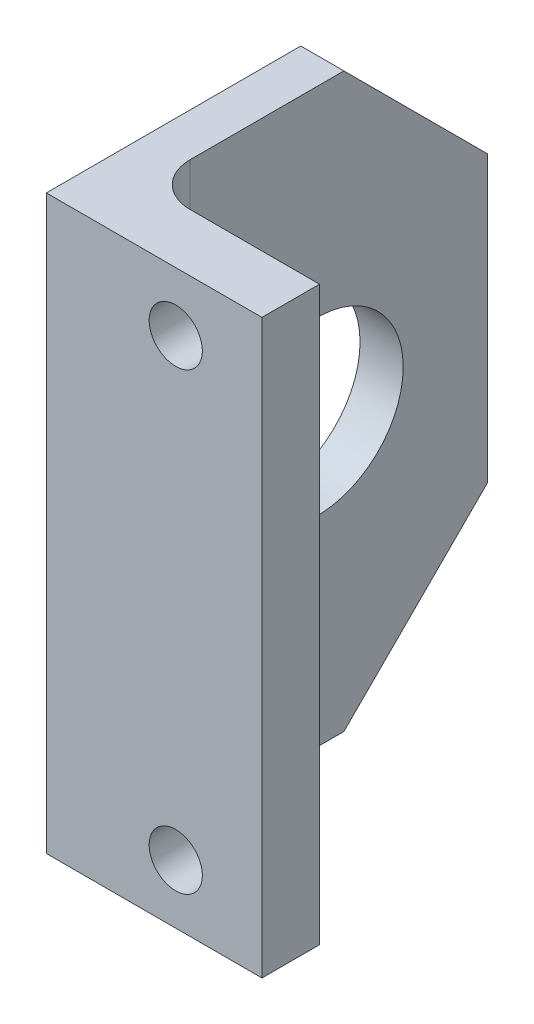
ISO-10303-21;
HEADER;
FILE_DESCRIPTION(('STEP AP214'),'2;1');
FILE_NAME('part.step','',(''),(''),'','','');
FILE_SCHEMA(('AUTOMOTIVE_DESIGN { 1 0 10303 214 1 1 1 1 }'));
ENDSEC;
DATA;
#1=APPLICATION_CONTEXT('core data for automotive mechanical design processes');
#2=APPLICATION_PROTOCOL_DEFINITION('international standard','automotive_design',2000,#1);
#3=PRODUCT_CONTEXT('',#1,'mechanical');
#4=PRODUCT('Part','Part','',(#3));
#5=PRODUCT_RELATED_PRODUCT_CATEGORY('part','',(#4));
#6=PRODUCT_DEFINITION_FORMATION('','',#4);
#7=PRODUCT_DEFINITION_CONTEXT('part definition',#1,'design');
#8=PRODUCT_DEFINITION('design','',#6,#7);
#9=PRODUCT_DEFINITION_SHAPE('','',#8);
#10=(LENGTH_UNIT() NAMED_UNIT(*) SI_UNIT(.MILLI.,.METRE.));
#11=(NAMED_UNIT(*) PLANE_ANGLE_UNIT() SI_UNIT($,.RADIAN.));
#12=(NAMED_UNIT(*) SI_UNIT($,.STERADIAN.) SOLID_ANGLE_UNIT());
#13=UNCERTAINTY_MEASURE_WITH_UNIT(LENGTH_MEASURE(1.E-05),#10,'distance_accuracy_value','');
#14=(GEOMETRIC_REPRESENTATION_CONTEXT(3) GLOBAL_UNCERTAINTY_ASSIGNED_CONTEXT((#13)) GLOBAL_UNIT_ASSIGNED_CONTEXT((#10,
#11,#12)) REPRESENTATION_CONTEXT('',''));
#15=CARTESIAN_POINT('',(0.,0.,0.));
#16=DIRECTION('',(0.,0.,1.));
#17=DIRECTION('',(1.,0.,0.));
#18=AXIS2_PLACEMENT_3D('',#15,#16,#17);
#19=CARTESIAN_POINT('',(15.,39.8,0.));
#20=DIRECTION('',(0.,0.,-1.));
#21=DIRECTION('',(-1.,0.,0.));
#22=AXIS2_PLACEMENT_3D('',#19,#20,#21);
#23=PLANE('',#22);
#24=CARTESIAN_POINT('',(9.00000000000001,35.7,0.));
#25=DIRECTION('',(0.,0.,-1.));
#26=DIRECTION('',(-1.,0.,0.));
#27=AXIS2_PLACEMENT_3D('',#24,#25,#26);
#28=CIRCLE('',#27,1.85);
#29=CARTESIAN_POINT('',(7.15000000000001,35.7,0.));
#30=VERTEX_POINT('',#29);
#31=EDGE_CURVE('E227',#30,#30,#28,.T.);
#32=ORIENTED_EDGE('',*,*,#31,.T.);
#33=EDGE_LOOP('',(#32));
#34=FACE_BOUND('',#33,.T.);
#35=CARTESIAN_POINT('',(9.00000000000001,4.10000000000001,0.));
#36=DIRECTION('',(0.,0.,-1.));
#37=DIRECTION('',(-1.,0.,0.));
#38=AXIS2_PLACEMENT_3D('',#35,#36,#37);
#39=CIRCLE('',#38,1.85);
#40=CARTESIAN_POINT('',(7.15000000000001,4.10000000000001,0.));
#41=VERTEX_POINT('',#40);
#42=EDGE_CURVE('E232',#41,#41,#39,.T.);
#43=ORIENTED_EDGE('',*,*,#42,.T.);
#44=EDGE_LOOP('',(#43));
#45=FACE_BOUND('',#44,.T.);
#46=DIRECTION('',(1.,0.,0.));
#47=VECTOR('',#46,1.);
#48=CARTESIAN_POINT('',(15.,0.,0.));
#49=LINE('',#48,#47);
#50=CARTESIAN_POINT('',(0.,0.,0.));
#51=VERTEX_POINT('',#50);
#52=CARTESIAN_POINT('',(15.,0.,0.));
#53=VERTEX_POINT('',#52);
#54=EDGE_CURVE('E138',#51,#53,#49,.T.);
#55=ORIENTED_EDGE('',*,*,#54,.T.);
#56=DIRECTION('',(0.,-1.,0.));
#57=VECTOR('',#56,1.);
#58=CARTESIAN_POINT('',(15.,39.8,0.));
#59=LINE('',#58,#57);
#60=CARTESIAN_POINT('',(15.,39.8,0.));
#61=VERTEX_POINT('',#60);
#62=EDGE_CURVE('E117',#61,#53,#59,.T.);
#63=ORIENTED_EDGE('',*,*,#62,.F.);
#64=DIRECTION('',(1.,0.,0.));
#65=VECTOR('',#64,1.);
#66=CARTESIAN_POINT('',(15.,39.8,0.));
#67=LINE('',#66,#65);
#68=CARTESIAN_POINT('',(0.,39.8,0.));
#69=VERTEX_POINT('',#68);
#70=EDGE_CURVE('E124',#69,#61,#67,.T.);
#71=ORIENTED_EDGE('',*,*,#70,.F.);
#72=DIRECTION('',(0.,-1.,0.));
#73=VECTOR('',#72,1.);
#74=CARTESIAN_POINT('',(0.,39.8,0.));
#75=LINE('',#74,#73);
#76=EDGE_CURVE('E207',#69,#51,#75,.T.);
#77=ORIENTED_EDGE('',*,*,#76,.T.);
#78=EDGE_LOOP('',(#55,#63,#71,#77));
#79=FACE_BOUND('',#78,.T.);
#80=ADVANCED_FACE('F41',(#34,#45,#79),#23,.F.);
#81=CARTESIAN_POINT('',(15.,39.8,-4.));
#82=DIRECTION('',(-1.,0.,0.));
#83=DIRECTION('',(0.,0.,1.));
#84=AXIS2_PLACEMENT_3D('',#81,#82,#83);
#85=PLANE('',#84);
#86=DIRECTION('',(0.,0.,-1.));
#87=VECTOR('',#86,1.);
#88=CARTESIAN_POINT('',(15.,0.,-4.));
#89=LINE('',#88,#87);
#90=CARTESIAN_POINT('',(15.,0.,-4.));
#91=VERTEX_POINT('',#90);
#92=EDGE_CURVE('E203',#53,#91,#89,.T.);
#93=ORIENTED_EDGE('',*,*,#92,.T.);
#94=DIRECTION('',(0.,-1.,0.));
#95=VECTOR('',#94,1.);
#96=CARTESIAN_POINT('',(15.,39.8,-4.));
#97=LINE('',#96,#95);
#98=CARTESIAN_POINT('',(15.,39.8,-4.));
#99=VERTEX_POINT('',#98);
#100=EDGE_CURVE('E120',#99,#91,#97,.T.);
#101=ORIENTED_EDGE('',*,*,#100,.F.);
#102=DIRECTION('',(0.,0.,-1.));
#103=VECTOR('',#102,1.);
#104=CARTESIAN_POINT('',(15.,39.8,-4.));
#105=LINE('',#104,#103);
#106=EDGE_CURVE('E113',#61,#99,#105,.T.);
#107=ORIENTED_EDGE('',*,*,#106,.F.);
#108=ORIENTED_EDGE('',*,*,#62,.T.);
#109=EDGE_LOOP('',(#93,#101,#107,#108));
#110=FACE_BOUND('',#109,.T.);
#111=ADVANCED_FACE('F115',(#110),#85,.F.);
#112=CARTESIAN_POINT('',(3.,39.8,-4.));
#113=DIRECTION('',(0.,0.,1.));
#114=DIRECTION('',(1.,0.,0.));
#115=AXIS2_PLACEMENT_3D('',#112,#113,#114);
#116=PLANE('',#115);
#117=CARTESIAN_POINT('',(9.00000000000001,35.7,-4.));
#118=DIRECTION('',(0.,0.,-1.));
#119=DIRECTION('',(-1.,0.,0.));
#120=AXIS2_PLACEMENT_3D('',#117,#118,#119);
#121=CIRCLE('',#120,1.85);
#122=CARTESIAN_POINT('',(7.15000000000001,35.7,-4.));
#123=VERTEX_POINT('',#122);
#124=EDGE_CURVE('E244',#123,#123,#121,.T.);
#125=ORIENTED_EDGE('',*,*,#124,.F.);
#126=EDGE_LOOP('',(#125));
#127=FACE_BOUND('',#126,.T.);
#128=CARTESIAN_POINT('',(9.00000000000001,4.10000000000001,-4.));
#129=DIRECTION('',(0.,0.,-1.));
#130=DIRECTION('',(1.,0.,0.));
#131=AXIS2_PLACEMENT_3D('',#128,#129,#130);
#132=CIRCLE('',#131,1.85);
#133=CARTESIAN_POINT('',(7.15000000000001,4.10000000000001,-4.));
#134=VERTEX_POINT('',#133);
#135=EDGE_CURVE('E153',#134,#134,#132,.T.);
#136=ORIENTED_EDGE('',*,*,#135,.F.);
#137=EDGE_LOOP('',(#136));
#138=FACE_BOUND('',#137,.T.);
#139=DIRECTION('',(-1.,0.,0.));
#140=VECTOR('',#139,1.);
#141=CARTESIAN_POINT('',(3.,0.,-4.));
#142=LINE('',#141,#140);
#143=CARTESIAN_POINT('',(6.,0.,-4.));
#144=VERTEX_POINT('',#143);
#145=EDGE_CURVE('E198',#91,#144,#142,.T.);
#146=ORIENTED_EDGE('',*,*,#145,.T.);
#147=DIRECTION('',(0.,-1.,0.));
#148=VECTOR('',#147,1.);
#149=CARTESIAN_POINT('',(6.,39.8,-4.));
#150=LINE('',#149,#148);
#151=CARTESIAN_POINT('',(6.,39.8,-4.));
#152=VERTEX_POINT('',#151);
#153=EDGE_CURVE('E57',#144,#152,#150,.F.);
#154=ORIENTED_EDGE('',*,*,#153,.T.);
#155=DIRECTION('',(-1.,0.,0.));
#156=VECTOR('',#155,1.);
#157=CARTESIAN_POINT('',(3.,39.8,-4.));
#158=LINE('',#157,#156);
#159=EDGE_CURVE('E123',#99,#152,#158,.T.);
#160=ORIENTED_EDGE('',*,*,#159,.F.);
#161=ORIENTED_EDGE('',*,*,#100,.T.);
#162=EDGE_LOOP('',(#146,#154,#160,#161));
#163=FACE_BOUND('',#162,.T.);
#164=ADVANCED_FACE('F259',(#127,#138,#163),#116,.F.);
#165=CARTESIAN_POINT('',(3.,39.8,-27.7));
#166=DIRECTION('',(-1.,0.,0.));
#167=DIRECTION('',(0.,0.,1.));
#168=AXIS2_PLACEMENT_3D('',#165,#166,#167);
#169=PLANE('',#168);
#170=CARTESIAN_POINT('',(3.,19.9,-15.85));
#171=DIRECTION('',(1.,0.,0.));
#172=DIRECTION('',(0.,0.,-1.));
#173=AXIS2_PLACEMENT_3D('',#170,#171,#172);
#174=CIRCLE('',#173,5.975);
#175=CARTESIAN_POINT('',(3.,19.9,-21.825));
#176=VERTEX_POINT('',#175);
#177=EDGE_CURVE('E154',#176,#176,#174,.T.);
#178=ORIENTED_EDGE('',*,*,#177,.F.);
#179=EDGE_LOOP('',(#178));
#180=FACE_BOUND('',#179,.T.);
#181=DIRECTION('',(0.,0.,-1.));
#182=VECTOR('',#181,1.);
#183=CARTESIAN_POINT('',(3.,39.8,-27.7));
#184=LINE('',#183,#182);
#185=CARTESIAN_POINT('',(3.,39.8,-7.));
#186=VERTEX_POINT('',#185);
#187=CARTESIAN_POINT('',(3.,39.8,-17.7));
#188=VERTEX_POINT('',#187);
#189=EDGE_CURVE('E190',#186,#188,#184,.T.);
#190=ORIENTED_EDGE('',*,*,#189,.F.);
#191=DIRECTION('',(0.,-1.,0.));
#192=VECTOR('',#191,1.);
#193=CARTESIAN_POINT('',(3.,0.,-7.));
#194=LINE('',#193,#192);
#195=CARTESIAN_POINT('',(3.,0.,-7.));
#196=VERTEX_POINT('',#195);
#197=EDGE_CURVE('E179',#186,#196,#194,.T.);
#198=ORIENTED_EDGE('',*,*,#197,.T.);
#199=DIRECTION('',(0.,0.,-1.));
#200=VECTOR('',#199,1.);
#201=CARTESIAN_POINT('',(3.,0.,-27.7));
#202=LINE('',#201,#200);
#203=CARTESIAN_POINT('',(3.,0.,-17.7));
#204=VERTEX_POINT('',#203);
#205=EDGE_CURVE('E189',#196,#204,#202,.T.);
#206=ORIENTED_EDGE('',*,*,#205,.T.);
#207=DIRECTION('',(0.,0.707106781186546,-0.707106781186549));
#208=VECTOR('',#207,1.);
#209=CARTESIAN_POINT('',(3.,9.99999999999999,-27.7));
#210=LINE('',#209,#208);
#211=CARTESIAN_POINT('',(3.,10.,-27.7));
#212=VERTEX_POINT('',#211);
#213=EDGE_CURVE('E173',#204,#212,#210,.T.);
#214=ORIENTED_EDGE('',*,*,#213,.T.);
#215=DIRECTION('',(0.,-1.,0.));
#216=VECTOR('',#215,1.);
#217=CARTESIAN_POINT('',(3.,39.8,-27.7));
#218=LINE('',#217,#216);
#219=CARTESIAN_POINT('',(3.,29.8,-27.7));
#220=VERTEX_POINT('',#219);
#221=EDGE_CURVE('E146',#220,#212,#218,.T.);
#222=ORIENTED_EDGE('',*,*,#221,.F.);
#223=DIRECTION('',(0.,-0.707106781186549,-0.707106781186546));
#224=VECTOR('',#223,1.);
#225=CARTESIAN_POINT('',(3.,39.8,-17.7));
#226=LINE('',#225,#224);
#227=EDGE_CURVE('E169',#220,#188,#226,.F.);
#228=ORIENTED_EDGE('',*,*,#227,.T.);
#229=EDGE_LOOP('',(#190,#198,#206,#214,#222,#228));
#230=FACE_BOUND('',#229,.T.);
#231=ADVANCED_FACE('F188',(#180,#230),#169,.F.);
#232=CARTESIAN_POINT('',(0.,39.8,-27.7));
#233=DIRECTION('',(0.,0.,1.));
#234=DIRECTION('',(1.,0.,0.));
#235=AXIS2_PLACEMENT_3D('',#232,#233,#234);
#236=PLANE('',#235);
#237=ORIENTED_EDGE('',*,*,#221,.T.);
#238=DIRECTION('',(-1.,0.,0.));
#239=VECTOR('',#238,1.);
#240=CARTESIAN_POINT('',(0.,9.99999999999999,-27.7));
#241=LINE('',#240,#239);
#242=CARTESIAN_POINT('',(0.,10.,-27.7));
#243=VERTEX_POINT('',#242);
#244=EDGE_CURVE('E144',#212,#243,#241,.T.);
#245=ORIENTED_EDGE('',*,*,#244,.T.);
#246=DIRECTION('',(0.,-1.,0.));
#247=VECTOR('',#246,1.);
#248=CARTESIAN_POINT('',(0.,39.8,-27.7));
#249=LINE('',#248,#247);
#250=CARTESIAN_POINT('',(0.,29.8,-27.7));
#251=VERTEX_POINT('',#250);
#252=EDGE_CURVE('E210',#251,#243,#249,.T.);
#253=ORIENTED_EDGE('',*,*,#252,.F.);
#254=DIRECTION('',(1.,0.,0.));
#255=VECTOR('',#254,1.);
#256=CARTESIAN_POINT('',(0.,29.8,-27.7));
#257=LINE('',#256,#255);
#258=EDGE_CURVE('E140',#251,#220,#257,.T.);
#259=ORIENTED_EDGE('',*,*,#258,.T.);
#260=EDGE_LOOP('',(#237,#245,#253,#259));
#261=FACE_BOUND('',#260,.T.);
#262=ADVANCED_FACE('F218',(#261),#236,.F.);
#263=CARTESIAN_POINT('',(0.,39.8,0.));
#264=DIRECTION('',(1.,0.,0.));
#265=DIRECTION('',(0.,0.,-1.));
#266=AXIS2_PLACEMENT_3D('',#263,#264,#265);
#267=PLANE('',#266);
#268=CARTESIAN_POINT('',(0.,19.9,-15.85));
#269=DIRECTION('',(1.,0.,0.));
#270=DIRECTION('',(0.,0.,-1.));
#271=AXIS2_PLACEMENT_3D('',#268,#269,#270);
#272=CIRCLE('',#271,5.975);
#273=CARTESIAN_POINT('',(0.,19.9,-21.825));
#274=VERTEX_POINT('',#273);
#275=EDGE_CURVE('E150',#274,#274,#272,.T.);
#276=ORIENTED_EDGE('',*,*,#275,.T.);
#277=EDGE_LOOP('',(#276));
#278=FACE_BOUND('',#277,.T.);
#279=ORIENTED_EDGE('',*,*,#252,.T.);
#280=DIRECTION('',(0.,-0.707106781186546,0.707106781186549));
#281=VECTOR('',#280,1.);
#282=CARTESIAN_POINT('',(0.,9.99999999999999,-27.7));
#283=LINE('',#282,#281);
#284=CARTESIAN_POINT('',(0.,0.,-17.7));
#285=VERTEX_POINT('',#284);
#286=EDGE_CURVE('E162',#243,#285,#283,.T.);
#287=ORIENTED_EDGE('',*,*,#286,.T.);
#288=DIRECTION('',(0.,0.,1.));
#289=VECTOR('',#288,1.);
#290=CARTESIAN_POINT('',(0.,0.,0.));
#291=LINE('',#290,#289);
#292=EDGE_CURVE('E135',#285,#51,#291,.T.);
#293=ORIENTED_EDGE('',*,*,#292,.T.);
#294=ORIENTED_EDGE('',*,*,#76,.F.);
#295=DIRECTION('',(0.,0.,1.));
#296=VECTOR('',#295,1.);
#297=CARTESIAN_POINT('',(0.,39.8,0.));
#298=LINE('',#297,#296);
#299=CARTESIAN_POINT('',(0.,39.8,-17.7));
#300=VERTEX_POINT('',#299);
#301=EDGE_CURVE('E130',#300,#69,#298,.T.);
#302=ORIENTED_EDGE('',*,*,#301,.F.);
#303=DIRECTION('',(0.,0.707106781186549,0.707106781186546));
#304=VECTOR('',#303,1.);
#305=CARTESIAN_POINT('',(0.,39.8,-17.7));
#306=LINE('',#305,#304);
#307=EDGE_CURVE('E159',#300,#251,#306,.F.);
#308=ORIENTED_EDGE('',*,*,#307,.T.);
#309=EDGE_LOOP('',(#279,#287,#293,#294,#302,#308));
#310=FACE_BOUND('',#309,.T.);
#311=ADVANCED_FACE('F225',(#278,#310),#267,.F.);
#312=CARTESIAN_POINT('',(0.,39.8,0.));
#313=DIRECTION('',(0.,-1.,0.));
#314=DIRECTION('',(0.,0.,-1.));
#315=AXIS2_PLACEMENT_3D('',#312,#313,#314);
#316=PLANE('',#315);
#317=ORIENTED_EDGE('',*,*,#159,.T.);
#318=CARTESIAN_POINT('',(6.,39.8,-7.));
#319=DIRECTION('',(0.,-1.,0.));
#320=DIRECTION('',(0.,0.,-1.));
#321=AXIS2_PLACEMENT_3D('',#318,#319,#320);
#322=CIRCLE('',#321,3.);
#323=EDGE_CURVE('E11',#152,#186,#322,.T.);
#324=ORIENTED_EDGE('',*,*,#323,.T.);
#325=ORIENTED_EDGE('',*,*,#189,.T.);
#326=DIRECTION('',(-1.,0.,0.));
#327=VECTOR('',#326,1.);
#328=CARTESIAN_POINT('',(0.,39.8,-17.7));
#329=LINE('',#328,#327);
#330=EDGE_CURVE('E176',#188,#300,#329,.T.);
#331=ORIENTED_EDGE('',*,*,#330,.T.);
#332=ORIENTED_EDGE('',*,*,#301,.T.);
#333=ORIENTED_EDGE('',*,*,#70,.T.);
#334=ORIENTED_EDGE('',*,*,#106,.T.);
#335=EDGE_LOOP('',(#317,#324,#325,#331,#332,#333,#334));
#336=FACE_BOUND('',#335,.T.);
#337=ADVANCED_FACE('F127',(#336),#316,.F.);
#338=CARTESIAN_POINT('',(0.,0.,0.));
#339=DIRECTION('',(0.,-1.,0.));
#340=DIRECTION('',(0.,0.,-1.));
#341=AXIS2_PLACEMENT_3D('',#338,#339,#340);
#342=PLANE('',#341);
#343=ORIENTED_EDGE('',*,*,#292,.F.);
#344=DIRECTION('',(1.,0.,0.));
#345=VECTOR('',#344,1.);
#346=CARTESIAN_POINT('',(3.,0.,-17.7));
#347=LINE('',#346,#345);
#348=EDGE_CURVE('E165',#285,#204,#347,.T.);
#349=ORIENTED_EDGE('',*,*,#348,.T.);
#350=ORIENTED_EDGE('',*,*,#205,.F.);
#351=CARTESIAN_POINT('',(6.,0.,-7.));
#352=DIRECTION('',(0.,-1.,0.));
#353=DIRECTION('',(0.,0.,-1.));
#354=AXIS2_PLACEMENT_3D('',#351,#352,#353);
#355=CIRCLE('',#354,3.);
#356=EDGE_CURVE('E50',#196,#144,#355,.F.);
#357=ORIENTED_EDGE('',*,*,#356,.T.);
#358=ORIENTED_EDGE('',*,*,#145,.F.);
#359=ORIENTED_EDGE('',*,*,#92,.F.);
#360=ORIENTED_EDGE('',*,*,#54,.F.);
#361=EDGE_LOOP('',(#343,#349,#350,#357,#358,#359,#360));
#362=FACE_BOUND('',#361,.T.);
#363=ADVANCED_FACE('F194',(#362),#342,.T.);
#364=CARTESIAN_POINT('',(9.00000000000002,4.10000000000001,35.8));
#365=DIRECTION('',(0.,0.,-1.));
#366=DIRECTION('',(-1.,0.,0.));
#367=AXIS2_PLACEMENT_3D('',#364,#365,#366);
#368=CYLINDRICAL_SURFACE('',#367,1.85);
#369=CARTESIAN_POINT('',(7.15000000000001,4.10000000000001,-4.));
#370=CARTESIAN_POINT('',(7.15000000000001,4.10000000000001,-3.95833333333333));
#371=CARTESIAN_POINT('',(7.15000000000001,4.10000000000001,-3.91666666666666));
#372=CARTESIAN_POINT('',(7.15000000000001,4.10000000000001,-3.83333333333333));
#373=CARTESIAN_POINT('',(7.15000000000001,4.10000000000001,-3.79166666666666));
#374=CARTESIAN_POINT('',(7.15000000000001,4.10000000000001,-3.70833333333333));
#375=CARTESIAN_POINT('',(7.15000000000001,4.10000000000001,-3.66666666666666));
#376=CARTESIAN_POINT('',(7.15000000000001,4.10000000000001,-3.58333333333333));
#377=CARTESIAN_POINT('',(7.15000000000001,4.10000000000001,-3.54166666666666));
#378=CARTESIAN_POINT('',(7.15000000000001,4.10000000000001,-3.45833333333333));
#379=CARTESIAN_POINT('',(7.15000000000001,4.10000000000001,-3.41666666666666));
#380=CARTESIAN_POINT('',(7.15000000000001,4.10000000000001,-3.33333333333333));
#381=CARTESIAN_POINT('',(7.15000000000001,4.10000000000001,-3.29166666666666));
#382=CARTESIAN_POINT('',(7.15000000000001,4.10000000000001,-3.20833333333333));
#383=CARTESIAN_POINT('',(7.15000000000001,4.10000000000001,-3.16666666666666));
#384=CARTESIAN_POINT('',(7.15000000000001,4.10000000000001,-3.08333333333333));
#385=CARTESIAN_POINT('',(7.15000000000001,4.10000000000001,-3.04166666666666));
#386=CARTESIAN_POINT('',(7.15000000000001,4.10000000000001,-2.95833333333333));
#387=CARTESIAN_POINT('',(7.15000000000001,4.10000000000001,-2.91666666666666));
#388=CARTESIAN_POINT('',(7.15000000000001,4.10000000000001,-2.83333333333333));
#389=CARTESIAN_POINT('',(7.15000000000001,4.10000000000001,-2.79166666666666));
#390=CARTESIAN_POINT('',(7.15000000000001,4.10000000000001,-2.70833333333333));
#391=CARTESIAN_POINT('',(7.15000000000001,4.10000000000001,-2.66666666666666));
#392=CARTESIAN_POINT('',(7.15000000000001,4.10000000000001,-2.58333333333333));
#393=CARTESIAN_POINT('',(7.15000000000001,4.10000000000001,-2.54166666666666));
#394=CARTESIAN_POINT('',(7.15000000000001,4.10000000000001,-2.45833333333333));
#395=CARTESIAN_POINT('',(7.15000000000001,4.10000000000001,-2.41666666666666));
#396=CARTESIAN_POINT('',(7.15000000000001,4.10000000000001,-2.33333333333333));
#397=CARTESIAN_POINT('',(7.15000000000001,4.10000000000001,-2.29166666666666));
#398=CARTESIAN_POINT('',(7.15000000000001,4.10000000000001,-2.20833333333333));
#399=CARTESIAN_POINT('',(7.15000000000001,4.10000000000001,-2.16666666666666));
#400=CARTESIAN_POINT('',(7.15000000000001,4.10000000000001,-2.08333333333333));
#401=CARTESIAN_POINT('',(7.15000000000001,4.10000000000001,-2.04166666666666));
#402=CARTESIAN_POINT('',(7.15000000000001,4.10000000000001,-1.95833333333333));
#403=CARTESIAN_POINT('',(7.15000000000001,4.10000000000001,-1.91666666666666));
#404=CARTESIAN_POINT('',(7.15000000000001,4.10000000000001,-1.83333333333333));
#405=CARTESIAN_POINT('',(7.15000000000001,4.10000000000001,-1.79166666666666));
#406=CARTESIAN_POINT('',(7.15000000000001,4.10000000000001,-1.70833333333333));
#407=CARTESIAN_POINT('',(7.15000000000001,4.10000000000001,-1.66666666666666));
#408=CARTESIAN_POINT('',(7.15000000000001,4.10000000000001,-1.58333333333333));
#409=CARTESIAN_POINT('',(7.15000000000001,4.10000000000001,-1.54166666666666));
#410=CARTESIAN_POINT('',(7.15000000000001,4.10000000000001,-1.45833333333333));
#411=CARTESIAN_POINT('',(7.15000000000001,4.10000000000001,-1.41666666666666));
#412=CARTESIAN_POINT('',(7.15000000000001,4.10000000000001,-1.33333333333333));
#413=CARTESIAN_POINT('',(7.15000000000001,4.10000000000001,-1.29166666666666));
#414=CARTESIAN_POINT('',(7.15000000000001,4.10000000000001,-1.20833333333333));
#415=CARTESIAN_POINT('',(7.15000000000001,4.10000000000001,-1.16666666666666));
#416=CARTESIAN_POINT('',(7.15000000000001,4.10000000000001,-1.08333333333333));
#417=CARTESIAN_POINT('',(7.15000000000001,4.10000000000001,-1.04166666666666));
#418=CARTESIAN_POINT('',(7.15000000000001,4.10000000000001,-0.958333333333327));
#419=CARTESIAN_POINT('',(7.15000000000001,4.10000000000001,-0.916666666666661));
#420=CARTESIAN_POINT('',(7.15000000000001,4.10000000000001,-0.833333333333327));
#421=CARTESIAN_POINT('',(7.15000000000001,4.10000000000001,-0.79166666666666));
#422=CARTESIAN_POINT('',(7.15000000000001,4.10000000000001,-0.708333333333327));
#423=CARTESIAN_POINT('',(7.15000000000001,4.10000000000001,-0.66666666666666));
#424=CARTESIAN_POINT('',(7.15000000000001,4.10000000000001,-0.583333333333327));
#425=CARTESIAN_POINT('',(7.15000000000001,4.10000000000001,-0.54166666666666));
#426=CARTESIAN_POINT('',(7.15000000000001,4.10000000000001,-0.458333333333327));
#427=CARTESIAN_POINT('',(7.15000000000001,4.10000000000001,-0.41666666666666));
#428=CARTESIAN_POINT('',(7.15000000000001,4.10000000000001,-0.333333333333327));
#429=CARTESIAN_POINT('',(7.15000000000001,4.10000000000001,-0.29166666666666));
#430=CARTESIAN_POINT('',(7.15000000000001,4.10000000000001,-0.208333333333327));
#431=CARTESIAN_POINT('',(7.15000000000001,4.10000000000001,-0.16666666666666));
#432=CARTESIAN_POINT('',(7.15000000000001,4.10000000000001,-0.0833333333333265));
#433=CARTESIAN_POINT('',(7.15000000000001,4.10000000000001,-0.0416666666666597));
#434=CARTESIAN_POINT('',(7.15000000000001,4.10000000000001,0.));
#435=B_SPLINE_CURVE_WITH_KNOTS('',3,(#369,#370,#371,#372,#373,#374,#375,#376,#377,#378,#379,
#380,#381,#382,#383,#384,#385,#386,#387,#388,#389,#390,#391,#392,#393,#394,#395,#396,#397,#398,
#399,#400,#401,#402,#403,#404,#405,#406,#407,#408,#409,#410,#411,#412,#413,#414,#415,#416,#417,
#418,#419,#420,#421,#422,#423,#424,#425,#426,#427,#428,#429,#430,#431,#432,#433,#434),
.UNSPECIFIED.,.F.,.F.,(4,2,2,2,2,2,2,2,2,2,2,2,2,2,2,2,2,2,2,2,2,2,2,2,2,2,2,2,2,2,2,2,4),(0.,
0.125,0.25,0.375,0.5,0.625000000000001,0.750000000000001,0.875000000000001,1.,1.125,1.25,1.375,
1.5,1.625,1.75,1.875,2.,2.125,2.25,2.375,2.5,2.625,2.75,2.875,3.,3.125,3.25,3.375,3.5,3.625,
3.75,3.875,4.),.UNSPECIFIED.);
#436=EDGE_CURVE('BSEAM303',#134,#41,#435,.T.);
#437=ORIENTED_EDGE('',*,*,#135,.T.);
#438=ORIENTED_EDGE('',*,*,#42,.F.);
#439=ORIENTED_EDGE('',*,*,#436,.T.);
#440=ORIENTED_EDGE('',*,*,#436,.F.);
#441=EDGE_LOOP('',(#437,#439,#438,#440));
#442=FACE_BOUND('',#441,.T.);
#443=ADVANCED_FACE('F303',(#442),#368,.F.);
#444=CARTESIAN_POINT('',(9.00000000000002,35.7,35.8));
#445=DIRECTION('',(0.,0.,-1.));
#446=DIRECTION('',(-1.,0.,0.));
#447=AXIS2_PLACEMENT_3D('',#444,#445,#446);
#448=CYLINDRICAL_SURFACE('',#447,1.85);
#449=CARTESIAN_POINT('',(7.15000000000001,35.7,-4.));
#450=CARTESIAN_POINT('',(7.15000000000001,35.7,-3.95833333333333));
#451=CARTESIAN_POINT('',(7.15000000000001,35.7,-3.91666666666666));
#452=CARTESIAN_POINT('',(7.15000000000001,35.7,-3.83333333333333));
#453=CARTESIAN_POINT('',(7.15000000000001,35.7,-3.79166666666666));
#454=CARTESIAN_POINT('',(7.15000000000001,35.7,-3.70833333333333));
#455=CARTESIAN_POINT('',(7.15000000000001,35.7,-3.66666666666666));
#456=CARTESIAN_POINT('',(7.15000000000001,35.7,-3.58333333333333));
#457=CARTESIAN_POINT('',(7.15000000000001,35.7,-3.54166666666666));
#458=CARTESIAN_POINT('',(7.15000000000001,35.7,-3.45833333333333));
#459=CARTESIAN_POINT('',(7.15000000000001,35.7,-3.41666666666666));
#460=CARTESIAN_POINT('',(7.15000000000001,35.7,-3.33333333333333));
#461=CARTESIAN_POINT('',(7.15000000000001,35.7,-3.29166666666666));
#462=CARTESIAN_POINT('',(7.15000000000001,35.7,-3.20833333333333));
#463=CARTESIAN_POINT('',(7.15000000000001,35.7,-3.16666666666666));
#464=CARTESIAN_POINT('',(7.15000000000001,35.7,-3.08333333333333));
#465=CARTESIAN_POINT('',(7.15000000000001,35.7,-3.04166666666666));
#466=CARTESIAN_POINT('',(7.15000000000001,35.7,-2.95833333333333));
#467=CARTESIAN_POINT('',(7.15000000000001,35.7,-2.91666666666666));
#468=CARTESIAN_POINT('',(7.15000000000001,35.7,-2.83333333333333));
#469=CARTESIAN_POINT('',(7.15000000000001,35.7,-2.79166666666666));
#470=CARTESIAN_POINT('',(7.15000000000001,35.7,-2.70833333333333));
#471=CARTESIAN_POINT('',(7.15000000000001,35.7,-2.66666666666666));
#472=CARTESIAN_POINT('',(7.15000000000001,35.7,-2.58333333333333));
#473=CARTESIAN_POINT('',(7.15000000000001,35.7,-2.54166666666666));
#474=CARTESIAN_POINT('',(7.15000000000001,35.7,-2.45833333333333));
#475=CARTESIAN_POINT('',(7.15000000000001,35.7,-2.41666666666666));
#476=CARTESIAN_POINT('',(7.15000000000001,35.7,-2.33333333333333));
#477=CARTESIAN_POINT('',(7.15000000000001,35.7,-2.29166666666666));
#478=CARTESIAN_POINT('',(7.15000000000001,35.7,-2.20833333333333));
#479=CARTESIAN_POINT('',(7.15000000000001,35.7,-2.16666666666666));
#480=CARTESIAN_POINT('',(7.15000000000001,35.7,-2.08333333333333));
#481=CARTESIAN_POINT('',(7.15000000000001,35.7,-2.04166666666666));
#482=CARTESIAN_POINT('',(7.15000000000001,35.7,-1.95833333333333));
#483=CARTESIAN_POINT('',(7.15000000000001,35.7,-1.91666666666666));
#484=CARTESIAN_POINT('',(7.15000000000001,35.7,-1.83333333333333));
#485=CARTESIAN_POINT('',(7.15000000000001,35.7,-1.79166666666666));
#486=CARTESIAN_POINT('',(7.15000000000001,35.7,-1.70833333333333));
#487=CARTESIAN_POINT('',(7.15000000000001,35.7,-1.66666666666666));
#488=CARTESIAN_POINT('',(7.15000000000001,35.7,-1.58333333333333));
#489=CARTESIAN_POINT('',(7.15000000000001,35.7,-1.54166666666666));
#490=CARTESIAN_POINT('',(7.15000000000001,35.7,-1.45833333333333));
#491=CARTESIAN_POINT('',(7.15000000000001,35.7,-1.41666666666666));
#492=CARTESIAN_POINT('',(7.15000000000001,35.7,-1.33333333333333));
#493=CARTESIAN_POINT('',(7.15000000000001,35.7,-1.29166666666666));
#494=CARTESIAN_POINT('',(7.15000000000001,35.7,-1.20833333333333));
#495=CARTESIAN_POINT('',(7.15000000000001,35.7,-1.16666666666666));
#496=CARTESIAN_POINT('',(7.15000000000001,35.7,-1.08333333333333));
#497=CARTESIAN_POINT('',(7.15000000000001,35.7,-1.04166666666666));
#498=CARTESIAN_POINT('',(7.15000000000001,35.7,-0.958333333333327));
#499=CARTESIAN_POINT('',(7.15000000000001,35.7,-0.916666666666661));
#500=CARTESIAN_POINT('',(7.15000000000001,35.7,-0.833333333333327));
#501=CARTESIAN_POINT('',(7.15000000000001,35.7,-0.79166666666666));
#502=CARTESIAN_POINT('',(7.15000000000001,35.7,-0.708333333333327));
#503=CARTESIAN_POINT('',(7.15000000000001,35.7,-0.66666666666666));
#504=CARTESIAN_POINT('',(7.15000000000001,35.7,-0.583333333333327));
#505=CARTESIAN_POINT('',(7.15000000000001,35.7,-0.54166666666666));
#506=CARTESIAN_POINT('',(7.15000000000001,35.7,-0.458333333333327));
#507=CARTESIAN_POINT('',(7.15000000000001,35.7,-0.41666666666666));
#508=CARTESIAN_POINT('',(7.15000000000001,35.7,-0.333333333333327));
#509=CARTESIAN_POINT('',(7.15000000000001,35.7,-0.29166666666666));
#510=CARTESIAN_POINT('',(7.15000000000001,35.7,-0.208333333333327));
#511=CARTESIAN_POINT('',(7.15000000000001,35.7,-0.16666666666666));
#512=CARTESIAN_POINT('',(7.15000000000001,35.7,-0.0833333333333265));
#513=CARTESIAN_POINT('',(7.15000000000001,35.7,-0.0416666666666597));
#514=CARTESIAN_POINT('',(7.15000000000001,35.7,0.));
#515=B_SPLINE_CURVE_WITH_KNOTS('',3,(#449,#450,#451,#452,#453,#454,#455,#456,#457,#458,#459,
#460,#461,#462,#463,#464,#465,#466,#467,#468,#469,#470,#471,#472,#473,#474,#475,#476,#477,#478,
#479,#480,#481,#482,#483,#484,#485,#486,#487,#488,#489,#490,#491,#492,#493,#494,#495,#496,#497,
#498,#499,#500,#501,#502,#503,#504,#505,#506,#507,#508,#509,#510,#511,#512,#513,#514),
.UNSPECIFIED.,.F.,.F.,(4,2,2,2,2,2,2,2,2,2,2,2,2,2,2,2,2,2,2,2,2,2,2,2,2,2,2,2,2,2,2,2,4),(0.,
0.125,0.25,0.375,0.5,0.625000000000001,0.750000000000001,0.875000000000001,1.,1.125,1.25,1.375,
1.5,1.625,1.75,1.875,2.,2.125,2.25,2.375,2.5,2.625,2.75,2.875,3.,3.125,3.25,3.375,3.5,3.625,
3.75,3.875,4.),.UNSPECIFIED.);
#516=EDGE_CURVE('BSEAM357',#123,#30,#515,.T.);
#517=ORIENTED_EDGE('',*,*,#124,.T.);
#518=ORIENTED_EDGE('',*,*,#31,.F.);
#519=ORIENTED_EDGE('',*,*,#516,.T.);
#520=ORIENTED_EDGE('',*,*,#516,.F.);
#521=EDGE_LOOP('',(#517,#519,#518,#520));
#522=FACE_BOUND('',#521,.T.);
#523=ADVANCED_FACE('F357',(#522),#448,.F.);
#524=CARTESIAN_POINT('',(-36.8,19.9,-15.85));
#525=DIRECTION('',(1.,0.,0.));
#526=DIRECTION('',(0.,0.,-1.));
#527=AXIS2_PLACEMENT_3D('',#524,#525,#526);
#528=CYLINDRICAL_SURFACE('',#527,5.975);
#529=CARTESIAN_POINT('',(3.,19.9,-21.825));
#530=CARTESIAN_POINT('',(2.96875,19.9,-21.825));
#531=CARTESIAN_POINT('',(2.9375,19.9,-21.825));
#532=CARTESIAN_POINT('',(2.875,19.9,-21.825));
#533=CARTESIAN_POINT('',(2.84375,19.9,-21.825));
#534=CARTESIAN_POINT('',(2.78125,19.9,-21.825));
#535=CARTESIAN_POINT('',(2.75,19.9,-21.825));
#536=CARTESIAN_POINT('',(2.6875,19.9,-21.825));
#537=CARTESIAN_POINT('',(2.65625,19.9,-21.825));
#538=CARTESIAN_POINT('',(2.59375,19.9,-21.825));
#539=CARTESIAN_POINT('',(2.5625,19.9,-21.825));
#540=CARTESIAN_POINT('',(2.5,19.9,-21.825));
#541=CARTESIAN_POINT('',(2.46875,19.9,-21.825));
#542=CARTESIAN_POINT('',(2.40625,19.9,-21.825));
#543=CARTESIAN_POINT('',(2.375,19.9,-21.825));
#544=CARTESIAN_POINT('',(2.3125,19.9,-21.825));
#545=CARTESIAN_POINT('',(2.28125,19.9,-21.825));
#546=CARTESIAN_POINT('',(2.21875,19.9,-21.825));
#547=CARTESIAN_POINT('',(2.1875,19.9,-21.825));
#548=CARTESIAN_POINT('',(2.125,19.9,-21.825));
#549=CARTESIAN_POINT('',(2.09375,19.9,-21.825));
#550=CARTESIAN_POINT('',(2.03125,19.9,-21.825));
#551=CARTESIAN_POINT('',(2.,19.9,-21.825));
#552=CARTESIAN_POINT('',(1.9375,19.9,-21.825));
#553=CARTESIAN_POINT('',(1.90625,19.9,-21.825));
#554=CARTESIAN_POINT('',(1.84375,19.9,-21.825));
#555=CARTESIAN_POINT('',(1.8125,19.9,-21.825));
#556=CARTESIAN_POINT('',(1.75,19.9,-21.825));
#557=CARTESIAN_POINT('',(1.71875,19.9,-21.825));
#558=CARTESIAN_POINT('',(1.65625,19.9,-21.825));
#559=CARTESIAN_POINT('',(1.625,19.9,-21.825));
#560=CARTESIAN_POINT('',(1.5625,19.9,-21.825));
#561=CARTESIAN_POINT('',(1.53125,19.9,-21.825));
#562=CARTESIAN_POINT('',(1.46874999999999,19.9,-21.825));
#563=CARTESIAN_POINT('',(1.43749999999999,19.9,-21.825));
#564=CARTESIAN_POINT('',(1.37499999999999,19.9,-21.825));
#565=CARTESIAN_POINT('',(1.34374999999999,19.9,-21.825));
#566=CARTESIAN_POINT('',(1.28124999999999,19.9,-21.825));
#567=CARTESIAN_POINT('',(1.24999999999999,19.9,-21.825));
#568=CARTESIAN_POINT('',(1.18749999999999,19.9,-21.825));
#569=CARTESIAN_POINT('',(1.15624999999999,19.9,-21.825));
#570=CARTESIAN_POINT('',(1.09374999999999,19.9,-21.825));
#571=CARTESIAN_POINT('',(1.06249999999999,19.9,-21.825));
#572=CARTESIAN_POINT('',(0.999999999999992,19.9,-21.825));
#573=CARTESIAN_POINT('',(0.968749999999993,19.9,-21.825));
#574=CARTESIAN_POINT('',(0.906249999999993,19.9,-21.825));
#575=CARTESIAN_POINT('',(0.874999999999992,19.9,-21.825));
#576=CARTESIAN_POINT('',(0.812499999999989,19.9,-21.825));
#577=CARTESIAN_POINT('',(0.781249999999988,19.9,-21.825));
#578=CARTESIAN_POINT('',(0.718749999999988,19.9,-21.825));
#579=CARTESIAN_POINT('',(0.687499999999989,19.9,-21.825));
#580=CARTESIAN_POINT('',(0.624999999999989,19.9,-21.825));
#581=CARTESIAN_POINT('',(0.593749999999988,19.9,-21.825));
#582=CARTESIAN_POINT('',(0.531249999999988,19.9,-21.825));
#583=CARTESIAN_POINT('',(0.499999999999989,19.9,-21.825));
#584=CARTESIAN_POINT('',(0.437499999999989,19.9,-21.825));
#585=CARTESIAN_POINT('',(0.406249999999988,19.9,-21.825));
#586=CARTESIAN_POINT('',(0.343749999999988,19.9,-21.825));
#587=CARTESIAN_POINT('',(0.312499999999989,19.9,-21.825));
#588=CARTESIAN_POINT('',(0.249999999999989,19.9,-21.825));
#589=CARTESIAN_POINT('',(0.218749999999987,19.9,-21.825));
#590=CARTESIAN_POINT('',(0.156249999999987,19.9,-21.825));
#591=CARTESIAN_POINT('',(0.124999999999989,19.9,-21.825));
#592=CARTESIAN_POINT('',(0.0624999999999885,19.9,-21.825));
#593=CARTESIAN_POINT('',(0.0312499999999873,19.9,-21.825));
#594=CARTESIAN_POINT('',(0.,19.9,-21.825));
#595=B_SPLINE_CURVE_WITH_KNOTS('',3,(#529,#530,#531,#532,#533,#534,#535,#536,#537,#538,#539,
#540,#541,#542,#543,#544,#545,#546,#547,#548,#549,#550,#551,#552,#553,#554,#555,#556,#557,#558,
#559,#560,#561,#562,#563,#564,#565,#566,#567,#568,#569,#570,#571,#572,#573,#574,#575,#576,#577,
#578,#579,#580,#581,#582,#583,#584,#585,#586,#587,#588,#589,#590,#591,#592,#593,#594),
.UNSPECIFIED.,.F.,.F.,(4,2,2,2,2,2,2,2,2,2,2,2,2,2,2,2,2,2,2,2,2,2,2,2,2,2,2,2,2,2,2,2,4),(0.,
0.0937500000000036,0.1875,0.281250000000004,0.375,0.468750000000004,0.5625,0.656250000000004,
0.750000000000001,0.843750000000004,0.937500000000008,1.03125,1.12500000000001,1.21875,
1.31250000000001,1.40625,1.50000000000001,1.59375000000001,1.68750000000001,1.78125000000001,
1.87500000000001,1.96875000000001,2.06250000000001,2.15625000000001,2.25000000000002,
2.34375000000001,2.43750000000002,2.53125000000001,2.62500000000002,2.71875000000001,
2.81250000000002,2.90625000000001,3.00000000000002),.UNSPECIFIED.);
#596=EDGE_CURVE('BSEAM255',#176,#274,#595,.T.);
#597=ORIENTED_EDGE('',*,*,#177,.T.);
#598=ORIENTED_EDGE('',*,*,#275,.F.);
#599=ORIENTED_EDGE('',*,*,#596,.T.);
#600=ORIENTED_EDGE('',*,*,#596,.F.);
#601=EDGE_LOOP('',(#597,#599,#598,#600));
#602=FACE_BOUND('',#601,.T.);
#603=ADVANCED_FACE('F255',(#602),#528,.F.);
#604=CARTESIAN_POINT('',(0.,9.99999999999999,-27.7));
#605=DIRECTION('',(0.,-0.707106781186549,-0.707106781186546));
#606=DIRECTION('',(1.,0.,0.));
#607=AXIS2_PLACEMENT_3D('',#604,#605,#606);
#608=PLANE('',#607);
#609=ORIENTED_EDGE('',*,*,#213,.F.);
#610=ORIENTED_EDGE('',*,*,#348,.F.);
#611=ORIENTED_EDGE('',*,*,#286,.F.);
#612=ORIENTED_EDGE('',*,*,#244,.F.);
#613=EDGE_LOOP('',(#609,#610,#611,#612));
#614=FACE_BOUND('',#613,.T.);
#615=ADVANCED_FACE('F223',(#614),#608,.T.);
#616=CARTESIAN_POINT('',(0.,39.8,-17.7));
#617=DIRECTION('',(0.,-0.707106781186546,0.707106781186549));
#618=DIRECTION('',(-1.,0.,0.));
#619=AXIS2_PLACEMENT_3D('',#616,#617,#618);
#620=PLANE('',#619);
#621=ORIENTED_EDGE('',*,*,#227,.F.);
#622=ORIENTED_EDGE('',*,*,#258,.F.);
#623=ORIENTED_EDGE('',*,*,#307,.F.);
#624=ORIENTED_EDGE('',*,*,#330,.F.);
#625=EDGE_LOOP('',(#621,#622,#623,#624));
#626=FACE_BOUND('',#625,.T.);
#627=ADVANCED_FACE('F282',(#626),#620,.F.);
#628=CARTESIAN_POINT('',(6.,39.8,-7.));
#629=DIRECTION('',(0.,1.,0.));
#630=DIRECTION('',(0.,0.,1.));
#631=AXIS2_PLACEMENT_3D('',#628,#629,#630);
#632=CYLINDRICAL_SURFACE('',#631,3.);
#633=ORIENTED_EDGE('',*,*,#323,.F.);
#634=ORIENTED_EDGE('',*,*,#153,.F.);
#635=ORIENTED_EDGE('',*,*,#356,.F.);
#636=ORIENTED_EDGE('',*,*,#197,.F.);
#637=EDGE_LOOP('',(#633,#634,#635,#636));
#638=FACE_BOUND('',#637,.T.);
#639=ADVANCED_FACE('F43',(#638),#632,.F.);
#640=CLOSED_SHELL('',(#80,#111,#164,#231,#262,#311,#337,#363,#443,#523,#603,#615,#627,#639));
#641=MANIFOLD_SOLID_BREP('B2',#640);
#642=ADVANCED_BREP_SHAPE_REPRESENTATION('',(#18,#641),#14);
#643=SHAPE_DEFINITION_REPRESENTATION(#9,#642);
ENDSEC;
END-ISO-10303-21;
